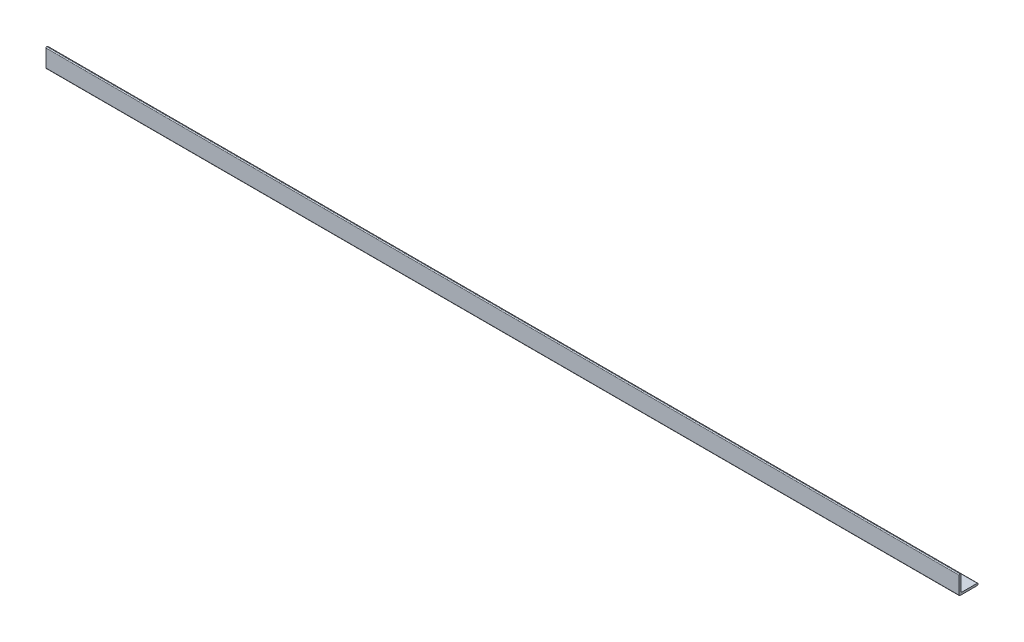
ISO-10303-21;
HEADER;
FILE_DESCRIPTION(('STEP AP214'),'2;1');
FILE_NAME('part.step','',(''),(''),'','','');
FILE_SCHEMA(('AUTOMOTIVE_DESIGN { 1 0 10303 214 1 1 1 1 }'));
ENDSEC;
DATA;
#1=APPLICATION_CONTEXT('core data for automotive mechanical design processes');
#2=APPLICATION_PROTOCOL_DEFINITION('international standard','automotive_design',2000,#1);
#3=PRODUCT_CONTEXT('',#1,'mechanical');
#4=PRODUCT('Part','Part','',(#3));
#5=PRODUCT_RELATED_PRODUCT_CATEGORY('part','',(#4));
#6=PRODUCT_DEFINITION_FORMATION('','',#4);
#7=PRODUCT_DEFINITION_CONTEXT('part definition',#1,'design');
#8=PRODUCT_DEFINITION('design','',#6,#7);
#9=PRODUCT_DEFINITION_SHAPE('','',#8);
#10=(LENGTH_UNIT() NAMED_UNIT(*) SI_UNIT(.MILLI.,.METRE.));
#11=(NAMED_UNIT(*) PLANE_ANGLE_UNIT() SI_UNIT($,.RADIAN.));
#12=(NAMED_UNIT(*) SI_UNIT($,.STERADIAN.) SOLID_ANGLE_UNIT());
#13=UNCERTAINTY_MEASURE_WITH_UNIT(LENGTH_MEASURE(1.E-05),#10,'distance_accuracy_value','');
#14=(GEOMETRIC_REPRESENTATION_CONTEXT(3) GLOBAL_UNCERTAINTY_ASSIGNED_CONTEXT((#13)) GLOBAL_UNIT_ASSIGNED_CONTEXT((#10,
#11,#12)) REPRESENTATION_CONTEXT('',''));
#15=CARTESIAN_POINT('',(0.,0.,0.));
#16=DIRECTION('',(0.,0.,1.));
#17=DIRECTION('',(1.,0.,0.));
#18=AXIS2_PLACEMENT_3D('',#15,#16,#17);
#19=CARTESIAN_POINT('',(544.,2.5,-11.25));
#20=DIRECTION('',(-1.,0.,0.));
#21=DIRECTION('',(0.,0.,1.));
#22=AXIS2_PLACEMENT_3D('',#19,#20,#21);
#23=PLANE('',#22);
#24=DIRECTION('',(0.,-1.,0.));
#25=VECTOR('',#24,1.);
#26=CARTESIAN_POINT('',(544.,2.5,11.25));
#27=LINE('',#26,#25);
#28=CARTESIAN_POINT('',(544.,21.5,11.25));
#29=VERTEX_POINT('',#28);
#30=CARTESIAN_POINT('',(544.,1.,11.25));
#31=VERTEX_POINT('',#30);
#32=EDGE_CURVE('E126',#29,#31,#27,.T.);
#33=ORIENTED_EDGE('',*,*,#32,.T.);
#34=CARTESIAN_POINT('',(544.,1.,10.25));
#35=DIRECTION('',(-1.,0.,0.));
#36=DIRECTION('',(0.,0.,1.));
#37=AXIS2_PLACEMENT_3D('',#34,#35,#36);
#38=CIRCLE('',#37,1.);
#39=CARTESIAN_POINT('',(544.,0.,10.25));
#40=VERTEX_POINT('',#39);
#41=EDGE_CURVE('E162',#31,#40,#38,.F.);
#42=ORIENTED_EDGE('',*,*,#41,.T.);
#43=DIRECTION('',(0.,0.,-1.));
#44=VECTOR('',#43,1.);
#45=CARTESIAN_POINT('',(544.,0.,-11.25));
#46=LINE('',#45,#44);
#47=CARTESIAN_POINT('',(544.,0.,-10.25));
#48=VERTEX_POINT('',#47);
#49=EDGE_CURVE('E217',#40,#48,#46,.T.);
#50=ORIENTED_EDGE('',*,*,#49,.T.);
#51=CARTESIAN_POINT('',(544.,1.,-10.25));
#52=DIRECTION('',(-1.,0.,0.));
#53=DIRECTION('',(0.,0.,1.));
#54=AXIS2_PLACEMENT_3D('',#51,#52,#53);
#55=CIRCLE('',#54,1.);
#56=CARTESIAN_POINT('',(544.,1.,-11.25));
#57=VERTEX_POINT('',#56);
#58=EDGE_CURVE('E160',#48,#57,#55,.F.);
#59=ORIENTED_EDGE('',*,*,#58,.T.);
#60=DIRECTION('',(0.,-1.,0.));
#61=VECTOR('',#60,1.);
#62=CARTESIAN_POINT('',(544.,2.5,-11.25));
#63=LINE('',#62,#61);
#64=CARTESIAN_POINT('',(544.,1.5,-11.25));
#65=VERTEX_POINT('',#64);
#66=EDGE_CURVE('E150',#65,#57,#63,.T.);
#67=ORIENTED_EDGE('',*,*,#66,.F.);
#68=CARTESIAN_POINT('',(544.,1.5,-10.25));
#69=DIRECTION('',(-1.,0.,0.));
#70=DIRECTION('',(0.,0.,1.));
#71=AXIS2_PLACEMENT_3D('',#68,#69,#70);
#72=CIRCLE('',#71,1.);
#73=CARTESIAN_POINT('',(544.,2.5,-10.25));
#74=VERTEX_POINT('',#73);
#75=EDGE_CURVE('E133',#65,#74,#72,.F.);
#76=ORIENTED_EDGE('',*,*,#75,.T.);
#77=DIRECTION('',(0.,0.,-1.));
#78=VECTOR('',#77,1.);
#79=CARTESIAN_POINT('',(544.,2.5,-11.25));
#80=LINE('',#79,#78);
#81=CARTESIAN_POINT('',(544.,2.5,7.74999999999999));
#82=VERTEX_POINT('',#81);
#83=EDGE_CURVE('E207',#82,#74,#80,.T.);
#84=ORIENTED_EDGE('',*,*,#83,.F.);
#85=CARTESIAN_POINT('',(544.,3.5,7.75));
#86=DIRECTION('',(-1.,0.,0.));
#87=DIRECTION('',(0.,0.,1.));
#88=AXIS2_PLACEMENT_3D('',#85,#86,#87);
#89=CIRCLE('',#88,1.);
#90=CARTESIAN_POINT('',(544.,3.5,8.75));
#91=VERTEX_POINT('',#90);
#92=EDGE_CURVE('E11',#82,#91,#89,.T.);
#93=ORIENTED_EDGE('',*,*,#92,.T.);
#94=DIRECTION('',(0.,-1.,0.));
#95=VECTOR('',#94,1.);
#96=CARTESIAN_POINT('',(544.,22.5,8.75));
#97=LINE('',#96,#95);
#98=CARTESIAN_POINT('',(544.,21.5,8.75));
#99=VERTEX_POINT('',#98);
#100=EDGE_CURVE('E212',#99,#91,#97,.T.);
#101=ORIENTED_EDGE('',*,*,#100,.F.);
#102=CARTESIAN_POINT('',(544.,21.5,9.75));
#103=DIRECTION('',(-1.,0.,0.));
#104=DIRECTION('',(0.,0.,1.));
#105=AXIS2_PLACEMENT_3D('',#102,#103,#104);
#106=CIRCLE('',#105,1.);
#107=CARTESIAN_POINT('',(544.,22.5,9.75));
#108=VERTEX_POINT('',#107);
#109=EDGE_CURVE('E134',#99,#108,#106,.F.);
#110=ORIENTED_EDGE('',*,*,#109,.T.);
#111=DIRECTION('',(0.,0.,-1.));
#112=VECTOR('',#111,1.);
#113=CARTESIAN_POINT('',(544.,22.5,11.25));
#114=LINE('',#113,#112);
#115=CARTESIAN_POINT('',(544.,22.5,10.25));
#116=VERTEX_POINT('',#115);
#117=EDGE_CURVE('E128',#116,#108,#114,.T.);
#118=ORIENTED_EDGE('',*,*,#117,.F.);
#119=CARTESIAN_POINT('',(544.,21.5,10.25));
#120=DIRECTION('',(-1.,0.,0.));
#121=DIRECTION('',(0.,0.,1.));
#122=AXIS2_PLACEMENT_3D('',#119,#120,#121);
#123=CIRCLE('',#122,1.);
#124=EDGE_CURVE('E124',#116,#29,#123,.F.);
#125=ORIENTED_EDGE('',*,*,#124,.T.);
#126=EDGE_LOOP('',(#33,#42,#50,#59,#67,#76,#84,#93,#101,#110,#118,#125));
#127=FACE_BOUND('',#126,.T.);
#128=ADVANCED_FACE('F34',(#127),#23,.F.);
#129=CARTESIAN_POINT('',(-544.,2.5,-11.25));
#130=DIRECTION('',(0.,0.,1.));
#131=DIRECTION('',(1.,0.,0.));
#132=AXIS2_PLACEMENT_3D('',#129,#130,#131);
#133=PLANE('',#132);
#134=ORIENTED_EDGE('',*,*,#66,.T.);
#135=DIRECTION('',(-1.,0.,0.));
#136=VECTOR('',#135,1.);
#137=CARTESIAN_POINT('',(-544.,1.,-11.25));
#138=LINE('',#137,#136);
#139=CARTESIAN_POINT('',(-544.,1.,-11.25));
#140=VERTEX_POINT('',#139);
#141=EDGE_CURVE('E177',#57,#140,#138,.T.);
#142=ORIENTED_EDGE('',*,*,#141,.T.);
#143=DIRECTION('',(0.,-1.,0.));
#144=VECTOR('',#143,1.);
#145=CARTESIAN_POINT('',(-544.,2.5,-11.25));
#146=LINE('',#145,#144);
#147=CARTESIAN_POINT('',(-544.,1.5,-11.25));
#148=VERTEX_POINT('',#147);
#149=EDGE_CURVE('E154',#148,#140,#146,.T.);
#150=ORIENTED_EDGE('',*,*,#149,.F.);
#151=DIRECTION('',(-1.,0.,0.));
#152=VECTOR('',#151,1.);
#153=CARTESIAN_POINT('',(544.,1.5,-11.25));
#154=LINE('',#153,#152);
#155=EDGE_CURVE('E175',#148,#65,#154,.F.);
#156=ORIENTED_EDGE('',*,*,#155,.T.);
#157=EDGE_LOOP('',(#134,#142,#150,#156));
#158=FACE_BOUND('',#157,.T.);
#159=ADVANCED_FACE('F231',(#158),#133,.F.);
#160=CARTESIAN_POINT('',(-544.,2.5,-11.25));
#161=DIRECTION('',(1.,0.,0.));
#162=DIRECTION('',(0.,0.,-1.));
#163=AXIS2_PLACEMENT_3D('',#160,#161,#162);
#164=PLANE('',#163);
#165=DIRECTION('',(0.,0.,1.));
#166=VECTOR('',#165,1.);
#167=CARTESIAN_POINT('',(-544.,0.,-11.25));
#168=LINE('',#167,#166);
#169=CARTESIAN_POINT('',(-544.,0.,-10.25));
#170=VERTEX_POINT('',#169);
#171=CARTESIAN_POINT('',(-544.,0.,10.25));
#172=VERTEX_POINT('',#171);
#173=EDGE_CURVE('E220',#170,#172,#168,.T.);
#174=ORIENTED_EDGE('',*,*,#173,.T.);
#175=CARTESIAN_POINT('',(-544.,1.,10.25));
#176=DIRECTION('',(1.,0.,0.));
#177=DIRECTION('',(0.,0.,-1.));
#178=AXIS2_PLACEMENT_3D('',#175,#176,#177);
#179=CIRCLE('',#178,1.);
#180=CARTESIAN_POINT('',(-544.,1.,11.25));
#181=VERTEX_POINT('',#180);
#182=EDGE_CURVE('E173',#172,#181,#179,.F.);
#183=ORIENTED_EDGE('',*,*,#182,.T.);
#184=DIRECTION('',(0.,-1.,0.));
#185=VECTOR('',#184,1.);
#186=CARTESIAN_POINT('',(-544.,2.5,11.25));
#187=LINE('',#186,#185);
#188=CARTESIAN_POINT('',(-544.,21.5,11.25));
#189=VERTEX_POINT('',#188);
#190=EDGE_CURVE('E144',#189,#181,#187,.T.);
#191=ORIENTED_EDGE('',*,*,#190,.F.);
#192=CARTESIAN_POINT('',(-544.,21.5,10.25));
#193=DIRECTION('',(1.,0.,0.));
#194=DIRECTION('',(0.,0.,-1.));
#195=AXIS2_PLACEMENT_3D('',#192,#193,#194);
#196=CIRCLE('',#195,1.);
#197=CARTESIAN_POINT('',(-544.,22.5,10.25));
#198=VERTEX_POINT('',#197);
#199=EDGE_CURVE('E149',#189,#198,#196,.F.);
#200=ORIENTED_EDGE('',*,*,#199,.T.);
#201=DIRECTION('',(0.,0.,1.));
#202=VECTOR('',#201,1.);
#203=CARTESIAN_POINT('',(-544.,22.5,11.25));
#204=LINE('',#203,#202);
#205=CARTESIAN_POINT('',(-544.,22.5,9.75000000000013));
#206=VERTEX_POINT('',#205);
#207=EDGE_CURVE('E222',#206,#198,#204,.T.);
#208=ORIENTED_EDGE('',*,*,#207,.F.);
#209=CARTESIAN_POINT('',(-544.,21.5,9.75000000000013));
#210=DIRECTION('',(1.,0.,0.));
#211=DIRECTION('',(0.,0.,-1.));
#212=AXIS2_PLACEMENT_3D('',#209,#210,#211);
#213=CIRCLE('',#212,1.);
#214=CARTESIAN_POINT('',(-544.,21.5,8.75000000000013));
#215=VERTEX_POINT('',#214);
#216=EDGE_CURVE('E168',#206,#215,#213,.F.);
#217=ORIENTED_EDGE('',*,*,#216,.T.);
#218=DIRECTION('',(0.,-1.,0.));
#219=VECTOR('',#218,1.);
#220=CARTESIAN_POINT('',(-544.,22.5,8.75000000000013));
#221=LINE('',#220,#219);
#222=CARTESIAN_POINT('',(-544.,3.5,8.75000000000013));
#223=VERTEX_POINT('',#222);
#224=EDGE_CURVE('E198',#215,#223,#221,.T.);
#225=ORIENTED_EDGE('',*,*,#224,.T.);
#226=CARTESIAN_POINT('',(-544.,3.5,7.75000000000013));
#227=DIRECTION('',(1.,0.,0.));
#228=DIRECTION('',(0.,0.,-1.));
#229=AXIS2_PLACEMENT_3D('',#226,#227,#228);
#230=CIRCLE('',#229,1.);
#231=CARTESIAN_POINT('',(-544.,2.5,7.75000000000012));
#232=VERTEX_POINT('',#231);
#233=EDGE_CURVE('E42',#223,#232,#230,.T.);
#234=ORIENTED_EDGE('',*,*,#233,.T.);
#235=DIRECTION('',(0.,0.,1.));
#236=VECTOR('',#235,1.);
#237=CARTESIAN_POINT('',(-544.,2.5,-11.25));
#238=LINE('',#237,#236);
#239=CARTESIAN_POINT('',(-544.,2.5,-10.25));
#240=VERTEX_POINT('',#239);
#241=EDGE_CURVE('E145',#240,#232,#238,.T.);
#242=ORIENTED_EDGE('',*,*,#241,.F.);
#243=CARTESIAN_POINT('',(-544.,1.5,-10.25));
#244=DIRECTION('',(1.,0.,0.));
#245=DIRECTION('',(0.,0.,-1.));
#246=AXIS2_PLACEMENT_3D('',#243,#244,#245);
#247=CIRCLE('',#246,1.);
#248=EDGE_CURVE('E57',#240,#148,#247,.F.);
#249=ORIENTED_EDGE('',*,*,#248,.T.);
#250=ORIENTED_EDGE('',*,*,#149,.T.);
#251=CARTESIAN_POINT('',(-544.,1.,-10.25));
#252=DIRECTION('',(1.,0.,0.));
#253=DIRECTION('',(0.,0.,-1.));
#254=AXIS2_PLACEMENT_3D('',#251,#252,#253);
#255=CIRCLE('',#254,1.);
#256=EDGE_CURVE('E49',#140,#170,#255,.F.);
#257=ORIENTED_EDGE('',*,*,#256,.T.);
#258=EDGE_LOOP('',(#174,#183,#191,#200,#208,#217,#225,#234,#242,#249,#250,#257));
#259=FACE_BOUND('',#258,.T.);
#260=ADVANCED_FACE('F196',(#259),#164,.F.);
#261=CARTESIAN_POINT('',(-544.,2.5,11.25));
#262=DIRECTION('',(0.,0.,-1.));
#263=DIRECTION('',(-1.,0.,0.));
#264=AXIS2_PLACEMENT_3D('',#261,#262,#263);
#265=PLANE('',#264);
#266=ORIENTED_EDGE('',*,*,#190,.T.);
#267=DIRECTION('',(1.,0.,0.));
#268=VECTOR('',#267,1.);
#269=CARTESIAN_POINT('',(-544.,1.,11.25));
#270=LINE('',#269,#268);
#271=EDGE_CURVE('E143',#181,#31,#270,.T.);
#272=ORIENTED_EDGE('',*,*,#271,.T.);
#273=ORIENTED_EDGE('',*,*,#32,.F.);
#274=DIRECTION('',(1.,0.,0.));
#275=VECTOR('',#274,1.);
#276=CARTESIAN_POINT('',(-544.,21.5,11.25));
#277=LINE('',#276,#275);
#278=EDGE_CURVE('E140',#29,#189,#277,.F.);
#279=ORIENTED_EDGE('',*,*,#278,.T.);
#280=EDGE_LOOP('',(#266,#272,#273,#279));
#281=FACE_BOUND('',#280,.T.);
#282=ADVANCED_FACE('F139',(#281),#265,.F.);
#283=CARTESIAN_POINT('',(0.,2.5,0.));
#284=DIRECTION('',(0.,1.,0.));
#285=DIRECTION('',(0.,0.,1.));
#286=AXIS2_PLACEMENT_3D('',#283,#284,#285);
#287=PLANE('',#286);
#288=ORIENTED_EDGE('',*,*,#83,.T.);
#289=DIRECTION('',(-1.,0.,0.));
#290=VECTOR('',#289,1.);
#291=CARTESIAN_POINT('',(-544.,2.5,-10.25));
#292=LINE('',#291,#290);
#293=EDGE_CURVE('E181',#74,#240,#292,.T.);
#294=ORIENTED_EDGE('',*,*,#293,.T.);
#295=ORIENTED_EDGE('',*,*,#241,.T.);
#296=DIRECTION('',(-1.,0.,0.));
#297=VECTOR('',#296,1.);
#298=CARTESIAN_POINT('',(0.,2.5,7.75000000000006));
#299=LINE('',#298,#297);
#300=EDGE_CURVE('E179',#232,#82,#299,.F.);
#301=ORIENTED_EDGE('',*,*,#300,.T.);
#302=EDGE_LOOP('',(#288,#294,#295,#301));
#303=FACE_BOUND('',#302,.T.);
#304=ADVANCED_FACE('F204',(#303),#287,.T.);
#305=CARTESIAN_POINT('',(0.,0.,0.));
#306=DIRECTION('',(0.,1.,0.));
#307=DIRECTION('',(0.,0.,1.));
#308=AXIS2_PLACEMENT_3D('',#305,#306,#307);
#309=PLANE('',#308);
#310=ORIENTED_EDGE('',*,*,#49,.F.);
#311=DIRECTION('',(1.,0.,0.));
#312=VECTOR('',#311,1.);
#313=CARTESIAN_POINT('',(0.,0.,10.25));
#314=LINE('',#313,#312);
#315=EDGE_CURVE('E166',#40,#172,#314,.F.);
#316=ORIENTED_EDGE('',*,*,#315,.T.);
#317=ORIENTED_EDGE('',*,*,#173,.F.);
#318=DIRECTION('',(-1.,0.,0.));
#319=VECTOR('',#318,1.);
#320=CARTESIAN_POINT('',(0.,0.,-10.25));
#321=LINE('',#320,#319);
#322=EDGE_CURVE('E164',#170,#48,#321,.F.);
#323=ORIENTED_EDGE('',*,*,#322,.T.);
#324=EDGE_LOOP('',(#310,#316,#317,#323));
#325=FACE_BOUND('',#324,.T.);
#326=ADVANCED_FACE('F240',(#325),#309,.F.);
#327=CARTESIAN_POINT('',(544.,22.5,8.75));
#328=DIRECTION('',(0.,0.,1.));
#329=DIRECTION('',(1.,0.,0.));
#330=AXIS2_PLACEMENT_3D('',#327,#328,#329);
#331=PLANE('',#330);
#332=ORIENTED_EDGE('',*,*,#224,.F.);
#333=DIRECTION('',(-1.,0.,0.));
#334=VECTOR('',#333,1.);
#335=CARTESIAN_POINT('',(544.,21.5,8.75));
#336=LINE('',#335,#334);
#337=EDGE_CURVE('E192',#215,#99,#336,.F.);
#338=ORIENTED_EDGE('',*,*,#337,.T.);
#339=ORIENTED_EDGE('',*,*,#100,.T.);
#340=DIRECTION('',(-1.,0.,0.));
#341=VECTOR('',#340,1.);
#342=CARTESIAN_POINT('',(544.,3.5,8.75));
#343=LINE('',#342,#341);
#344=EDGE_CURVE('E189',#91,#223,#343,.T.);
#345=ORIENTED_EDGE('',*,*,#344,.T.);
#346=EDGE_LOOP('',(#332,#338,#339,#345));
#347=FACE_BOUND('',#346,.T.);
#348=ADVANCED_FACE('F215',(#347),#331,.F.);
#349=CARTESIAN_POINT('',(0.,22.5,0.));
#350=DIRECTION('',(0.,1.,0.));
#351=DIRECTION('',(0.,0.,1.));
#352=AXIS2_PLACEMENT_3D('',#349,#350,#351);
#353=PLANE('',#352);
#354=ORIENTED_EDGE('',*,*,#207,.T.);
#355=DIRECTION('',(1.,0.,0.));
#356=VECTOR('',#355,1.);
#357=CARTESIAN_POINT('',(544.,22.5,10.25));
#358=LINE('',#357,#356);
#359=EDGE_CURVE('E187',#198,#116,#358,.T.);
#360=ORIENTED_EDGE('',*,*,#359,.T.);
#361=ORIENTED_EDGE('',*,*,#117,.T.);
#362=DIRECTION('',(-1.,0.,0.));
#363=VECTOR('',#362,1.);
#364=CARTESIAN_POINT('',(-544.,22.5,9.75000000000013));
#365=LINE('',#364,#363);
#366=EDGE_CURVE('E184',#108,#206,#365,.T.);
#367=ORIENTED_EDGE('',*,*,#366,.T.);
#368=EDGE_LOOP('',(#354,#360,#361,#367));
#369=FACE_BOUND('',#368,.T.);
#370=ADVANCED_FACE('F248',(#369),#353,.T.);
#371=CARTESIAN_POINT('',(-544.,1.,10.25));
#372=DIRECTION('',(1.,0.,0.));
#373=DIRECTION('',(0.,0.,-1.));
#374=AXIS2_PLACEMENT_3D('',#371,#372,#373);
#375=CYLINDRICAL_SURFACE('',#374,1.);
#376=ORIENTED_EDGE('',*,*,#182,.F.);
#377=ORIENTED_EDGE('',*,*,#315,.F.);
#378=ORIENTED_EDGE('',*,*,#41,.F.);
#379=ORIENTED_EDGE('',*,*,#271,.F.);
#380=EDGE_LOOP('',(#376,#377,#378,#379));
#381=FACE_BOUND('',#380,.T.);
#382=ADVANCED_FACE('F244',(#381),#375,.T.);
#383=CARTESIAN_POINT('',(-544.,1.,-10.25));
#384=DIRECTION('',(-1.,0.,0.));
#385=DIRECTION('',(0.,0.,1.));
#386=AXIS2_PLACEMENT_3D('',#383,#384,#385);
#387=CYLINDRICAL_SURFACE('',#386,1.);
#388=ORIENTED_EDGE('',*,*,#58,.F.);
#389=ORIENTED_EDGE('',*,*,#322,.F.);
#390=ORIENTED_EDGE('',*,*,#256,.F.);
#391=ORIENTED_EDGE('',*,*,#141,.F.);
#392=EDGE_LOOP('',(#388,#389,#390,#391));
#393=FACE_BOUND('',#392,.T.);
#394=ADVANCED_FACE('F237',(#393),#387,.T.);
#395=CARTESIAN_POINT('',(0.,1.5,-10.25));
#396=DIRECTION('',(1.,0.,0.));
#397=DIRECTION('',(0.,0.,-1.));
#398=AXIS2_PLACEMENT_3D('',#395,#396,#397);
#399=CYLINDRICAL_SURFACE('',#398,1.);
#400=ORIENTED_EDGE('',*,*,#75,.F.);
#401=ORIENTED_EDGE('',*,*,#155,.F.);
#402=ORIENTED_EDGE('',*,*,#248,.F.);
#403=ORIENTED_EDGE('',*,*,#293,.F.);
#404=EDGE_LOOP('',(#400,#401,#402,#403));
#405=FACE_BOUND('',#404,.T.);
#406=ADVANCED_FACE('F235',(#405),#399,.T.);
#407=CARTESIAN_POINT('',(0.,21.5,10.25));
#408=DIRECTION('',(-1.,0.,0.));
#409=DIRECTION('',(0.,0.,1.));
#410=AXIS2_PLACEMENT_3D('',#407,#408,#409);
#411=CYLINDRICAL_SURFACE('',#410,1.);
#412=ORIENTED_EDGE('',*,*,#199,.F.);
#413=ORIENTED_EDGE('',*,*,#278,.F.);
#414=ORIENTED_EDGE('',*,*,#124,.F.);
#415=ORIENTED_EDGE('',*,*,#359,.F.);
#416=EDGE_LOOP('',(#412,#413,#414,#415));
#417=FACE_BOUND('',#416,.T.);
#418=ADVANCED_FACE('F148',(#417),#411,.T.);
#419=CARTESIAN_POINT('',(0.,21.5,9.75000000000006));
#420=DIRECTION('',(1.,0.,0.));
#421=DIRECTION('',(0.,0.,-1.));
#422=AXIS2_PLACEMENT_3D('',#419,#420,#421);
#423=CYLINDRICAL_SURFACE('',#422,1.);
#424=ORIENTED_EDGE('',*,*,#109,.F.);
#425=ORIENTED_EDGE('',*,*,#337,.F.);
#426=ORIENTED_EDGE('',*,*,#216,.F.);
#427=ORIENTED_EDGE('',*,*,#366,.F.);
#428=EDGE_LOOP('',(#424,#425,#426,#427));
#429=FACE_BOUND('',#428,.T.);
#430=ADVANCED_FACE('F252',(#429),#423,.T.);
#431=CARTESIAN_POINT('',(544.,3.5,7.75));
#432=DIRECTION('',(-1.,0.,0.));
#433=DIRECTION('',(0.,0.,1.));
#434=AXIS2_PLACEMENT_3D('',#431,#432,#433);
#435=CYLINDRICAL_SURFACE('',#434,1.);
#436=ORIENTED_EDGE('',*,*,#92,.F.);
#437=ORIENTED_EDGE('',*,*,#300,.F.);
#438=ORIENTED_EDGE('',*,*,#233,.F.);
#439=ORIENTED_EDGE('',*,*,#344,.F.);
#440=EDGE_LOOP('',(#436,#437,#438,#439));
#441=FACE_BOUND('',#440,.T.);
#442=ADVANCED_FACE('F36',(#441),#435,.F.);
#443=CLOSED_SHELL('',(#128,#159,#260,#282,#304,#326,#348,#370,#382,#394,#406,#418,#430,#442));
#444=MANIFOLD_SOLID_BREP('B2',#443);
#445=ADVANCED_BREP_SHAPE_REPRESENTATION('',(#18,#444),#14);
#446=SHAPE_DEFINITION_REPRESENTATION(#9,#445);
ENDSEC;
END-ISO-10303-21;
